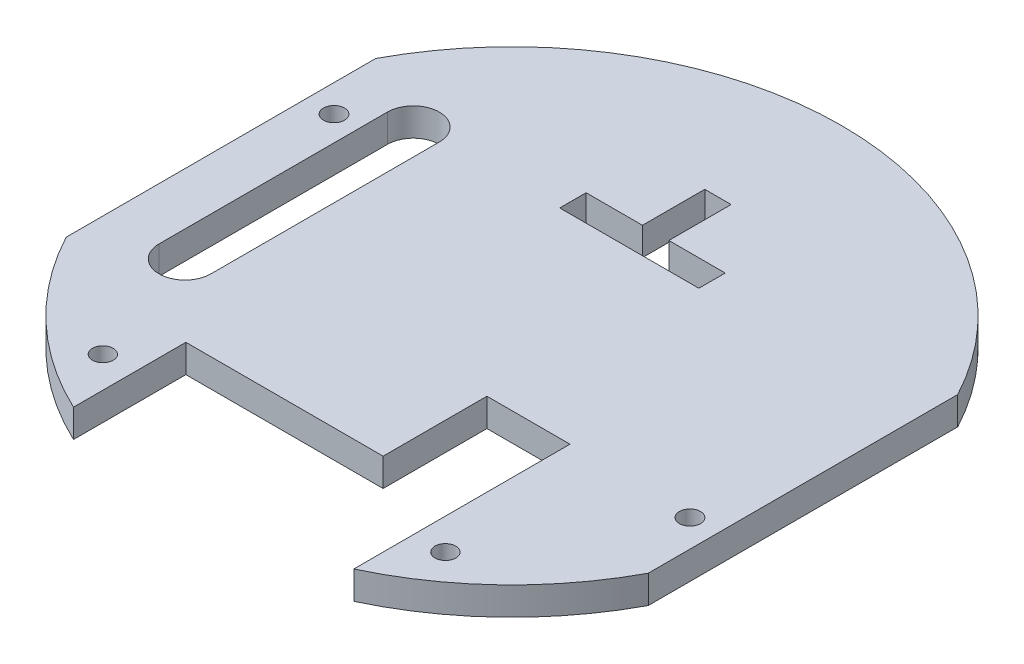
ISO-10303-21;
HEADER;
FILE_DESCRIPTION(('STEP AP214'),'2;1');
FILE_NAME('part.step','',(''),(''),'','','');
FILE_SCHEMA(('AUTOMOTIVE_DESIGN { 1 0 10303 214 1 1 1 1 }'));
ENDSEC;
DATA;
#1=APPLICATION_CONTEXT('core data for automotive mechanical design processes');
#2=APPLICATION_PROTOCOL_DEFINITION('international standard','automotive_design',2000,#1);
#3=PRODUCT_CONTEXT('',#1,'mechanical');
#4=PRODUCT('Part','Part','',(#3));
#5=PRODUCT_RELATED_PRODUCT_CATEGORY('part','',(#4));
#6=PRODUCT_DEFINITION_FORMATION('','',#4);
#7=PRODUCT_DEFINITION_CONTEXT('part definition',#1,'design');
#8=PRODUCT_DEFINITION('design','',#6,#7);
#9=PRODUCT_DEFINITION_SHAPE('','',#8);
#10=(LENGTH_UNIT() NAMED_UNIT(*) SI_UNIT(.MILLI.,.METRE.));
#11=(NAMED_UNIT(*) PLANE_ANGLE_UNIT() SI_UNIT($,.RADIAN.));
#12=(NAMED_UNIT(*) SI_UNIT($,.STERADIAN.) SOLID_ANGLE_UNIT());
#13=UNCERTAINTY_MEASURE_WITH_UNIT(LENGTH_MEASURE(1.E-05),#10,'distance_accuracy_value','');
#14=(GEOMETRIC_REPRESENTATION_CONTEXT(3) GLOBAL_UNCERTAINTY_ASSIGNED_CONTEXT((#13)) GLOBAL_UNIT_ASSIGNED_CONTEXT((#10,
#11,#12)) REPRESENTATION_CONTEXT('',''));
#15=CARTESIAN_POINT('',(0.,0.,0.));
#16=DIRECTION('',(0.,0.,1.));
#17=DIRECTION('',(1.,0.,0.));
#18=AXIS2_PLACEMENT_3D('',#15,#16,#17);
#19=CARTESIAN_POINT('',(0.,2.7,0.));
#20=DIRECTION('',(0.,-1.,0.));
#21=DIRECTION('',(0.,0.,-1.));
#22=AXIS2_PLACEMENT_3D('',#19,#20,#21);
#23=CYLINDRICAL_SURFACE('',#22,31.75);
#24=CARTESIAN_POINT('',(0.,0.,0.));
#25=DIRECTION('',(0.,1.,0.));
#26=DIRECTION('',(0.,0.,1.));
#27=AXIS2_PLACEMENT_3D('',#24,#25,#26);
#28=CIRCLE('',#27,31.75);
#29=CARTESIAN_POINT('',(-28.033586073271,0.,14.905722118452));
#30=VERTEX_POINT('',#29);
#31=CARTESIAN_POINT('',(-13.5,0.,28.7369535615729));
#32=VERTEX_POINT('',#31);
#33=EDGE_CURVE('E347',#30,#32,#28,.T.);
#34=ORIENTED_EDGE('',*,*,#33,.T.);
#35=DIRECTION('',(0.,-1.,0.));
#36=VECTOR('',#35,1.);
#37=CARTESIAN_POINT('',(-13.5,2.7,28.7369535615729));
#38=LINE('',#37,#36);
#39=CARTESIAN_POINT('',(-13.5,2.7,28.7369535615729));
#40=VERTEX_POINT('',#39);
#41=EDGE_CURVE('E363',#32,#40,#38,.F.);
#42=ORIENTED_EDGE('',*,*,#41,.T.);
#43=CARTESIAN_POINT('',(0.,2.7,0.));
#44=DIRECTION('',(0.,1.,0.));
#45=DIRECTION('',(0.,0.,1.));
#46=AXIS2_PLACEMENT_3D('',#43,#44,#45);
#47=CIRCLE('',#46,31.75);
#48=CARTESIAN_POINT('',(-28.033586073271,2.7,14.905722118452));
#49=VERTEX_POINT('',#48);
#50=EDGE_CURVE('E336',#49,#40,#47,.T.);
#51=ORIENTED_EDGE('',*,*,#50,.F.);
#52=DIRECTION('',(0.,-1.,0.));
#53=VECTOR('',#52,1.);
#54=CARTESIAN_POINT('',(-28.033586073271,2.7,14.905722118452));
#55=LINE('',#54,#53);
#56=EDGE_CURVE('E356',#49,#30,#55,.T.);
#57=ORIENTED_EDGE('',*,*,#56,.T.);
#58=EDGE_LOOP('',(#34,#42,#51,#57));
#59=FACE_BOUND('',#58,.T.);
#60=ADVANCED_FACE('F33',(#59),#23,.T.);
#61=CARTESIAN_POINT('',(6.69999999999999,2.7,-13.84));
#62=DIRECTION('',(0.,0.,1.));
#63=DIRECTION('',(1.,0.,0.));
#64=AXIS2_PLACEMENT_3D('',#61,#62,#63);
#65=PLANE('',#64);
#66=DIRECTION('',(0.,-1.,0.));
#67=VECTOR('',#66,1.);
#68=CARTESIAN_POINT('',(1.27,2.701,-13.84));
#69=LINE('',#68,#67);
#70=CARTESIAN_POINT('',(1.27,2.7,-13.84));
#71=VERTEX_POINT('',#70);
#72=CARTESIAN_POINT('',(1.27,0.,-13.84));
#73=VERTEX_POINT('',#72);
#74=EDGE_CURVE('E241',#71,#73,#69,.T.);
#75=ORIENTED_EDGE('',*,*,#74,.T.);
#76=DIRECTION('',(-1.,0.,0.));
#77=VECTOR('',#76,1.);
#78=CARTESIAN_POINT('',(6.69999999999999,0.,-13.84));
#79=LINE('',#78,#77);
#80=CARTESIAN_POINT('',(6.69999999999999,0.,-13.84));
#81=VERTEX_POINT('',#80);
#82=EDGE_CURVE('E310',#81,#73,#79,.T.);
#83=ORIENTED_EDGE('',*,*,#82,.F.);
#84=DIRECTION('',(0.,-1.,0.));
#85=VECTOR('',#84,1.);
#86=CARTESIAN_POINT('',(6.69999999999999,2.7,-13.84));
#87=LINE('',#86,#85);
#88=CARTESIAN_POINT('',(6.69999999999999,2.7,-13.84));
#89=VERTEX_POINT('',#88);
#90=EDGE_CURVE('E325',#89,#81,#87,.T.);
#91=ORIENTED_EDGE('',*,*,#90,.F.);
#92=DIRECTION('',(-1.,0.,0.));
#93=VECTOR('',#92,1.);
#94=CARTESIAN_POINT('',(6.69999999999999,2.7,-13.84));
#95=LINE('',#94,#93);
#96=EDGE_CURVE('E298',#89,#71,#95,.T.);
#97=ORIENTED_EDGE('',*,*,#96,.T.);
#98=EDGE_LOOP('',(#75,#83,#91,#97));
#99=FACE_BOUND('',#98,.T.);
#100=ADVANCED_FACE('F389',(#99),#65,.T.);
#101=CARTESIAN_POINT('',(0.,2.7,0.));
#102=DIRECTION('',(0.,1.,0.));
#103=DIRECTION('',(0.,0.,1.));
#104=AXIS2_PLACEMENT_3D('',#101,#102,#103);
#105=PLANE('',#104);
#106=CARTESIAN_POINT('',(16.5,2.7,22.9136652802601));
#107=DIRECTION('',(0.,1.,0.));
#108=DIRECTION('',(0.,0.,1.));
#109=AXIS2_PLACEMENT_3D('',#106,#107,#108);
#110=CIRCLE('',#109,1.00000000000001);
#111=CARTESIAN_POINT('',(16.5,2.7,23.9136652802601));
#112=VERTEX_POINT('',#111);
#113=EDGE_CURVE('E378',#112,#112,#110,.T.);
#114=ORIENTED_EDGE('',*,*,#113,.F.);
#115=EDGE_LOOP('',(#114));
#116=FACE_BOUND('',#115,.T.);
#117=CARTESIAN_POINT('',(-16.5,2.7,22.9136652802601));
#118=DIRECTION('',(0.,1.,0.));
#119=DIRECTION('',(0.,0.,1.));
#120=AXIS2_PLACEMENT_3D('',#117,#118,#119);
#121=CIRCLE('',#120,1.);
#122=CARTESIAN_POINT('',(-16.5,2.7,23.9136652802601));
#123=VERTEX_POINT('',#122);
#124=EDGE_CURVE('E370',#123,#123,#121,.T.);
#125=ORIENTED_EDGE('',*,*,#124,.F.);
#126=EDGE_LOOP('',(#125));
#127=FACE_BOUND('',#126,.T.);
#128=DIRECTION('',(0.,0.,1.));
#129=VECTOR('',#128,1.);
#130=CARTESIAN_POINT('',(-13.5,2.7,31.75));
#131=LINE('',#130,#129);
#132=CARTESIAN_POINT('',(-13.5,2.7,17.9136652802601));
#133=VERTEX_POINT('',#132);
#134=EDGE_CURVE('E203',#133,#40,#131,.T.);
#135=ORIENTED_EDGE('',*,*,#134,.F.);
#136=DIRECTION('',(-1.,0.,0.));
#137=VECTOR('',#136,1.);
#138=CARTESIAN_POINT('',(-13.5,2.7,17.9136652802601));
#139=LINE('',#138,#137);
#140=CARTESIAN_POINT('',(5.5,2.7,17.9136652802601));
#141=VERTEX_POINT('',#140);
#142=EDGE_CURVE('E195',#141,#133,#139,.T.);
#143=ORIENTED_EDGE('',*,*,#142,.F.);
#144=DIRECTION('',(0.,0.,1.));
#145=VECTOR('',#144,1.);
#146=CARTESIAN_POINT('',(5.5,2.7,17.9136652802601));
#147=LINE('',#146,#145);
#148=CARTESIAN_POINT('',(5.5,2.7,7.91366528026014));
#149=VERTEX_POINT('',#148);
#150=EDGE_CURVE('E210',#149,#141,#147,.T.);
#151=ORIENTED_EDGE('',*,*,#150,.F.);
#152=DIRECTION('',(-1.,0.,0.));
#153=VECTOR('',#152,1.);
#154=CARTESIAN_POINT('',(13.5,2.7,7.91366528026014));
#155=LINE('',#154,#153);
#156=CARTESIAN_POINT('',(13.5,2.7,7.91366528026014));
#157=VERTEX_POINT('',#156);
#158=EDGE_CURVE('E190',#157,#149,#155,.T.);
#159=ORIENTED_EDGE('',*,*,#158,.F.);
#160=DIRECTION('',(0.,0.,-1.));
#161=VECTOR('',#160,1.);
#162=CARTESIAN_POINT('',(13.5,2.7,17.9136652802601));
#163=LINE('',#162,#161);
#164=CARTESIAN_POINT('',(13.5,2.7,28.7369535615729));
#165=VERTEX_POINT('',#164);
#166=EDGE_CURVE('E198',#165,#157,#163,.T.);
#167=ORIENTED_EDGE('',*,*,#166,.F.);
#168=CARTESIAN_POINT('',(28.033586073271,2.7,14.905722118452));
#169=VERTEX_POINT('',#168);
#170=EDGE_CURVE('E335',#165,#169,#47,.T.);
#171=ORIENTED_EDGE('',*,*,#170,.T.);
#172=DIRECTION('',(0.,0.,-1.));
#173=VECTOR('',#172,1.);
#174=CARTESIAN_POINT('',(28.033586073271,2.7,-14.905722118452));
#175=LINE('',#174,#173);
#176=CARTESIAN_POINT('',(28.033586073271,2.7,-14.905722118452));
#177=VERTEX_POINT('',#176);
#178=EDGE_CURVE('E339',#169,#177,#175,.T.);
#179=ORIENTED_EDGE('',*,*,#178,.T.);
#180=CARTESIAN_POINT('',(0.,2.7,0.));
#181=DIRECTION('',(0.,1.,0.));
#182=DIRECTION('',(0.,0.,1.));
#183=AXIS2_PLACEMENT_3D('',#180,#181,#182);
#184=CIRCLE('',#183,31.75);
#185=CARTESIAN_POINT('',(-28.033586073271,2.7,-14.905722118452));
#186=VERTEX_POINT('',#185);
#187=EDGE_CURVE('E329',#177,#186,#184,.T.);
#188=ORIENTED_EDGE('',*,*,#187,.T.);
#189=DIRECTION('',(0.,0.,1.));
#190=VECTOR('',#189,1.);
#191=CARTESIAN_POINT('',(-28.033586073271,2.7,-14.905722118452));
#192=LINE('',#191,#190);
#193=EDGE_CURVE('E332',#186,#49,#192,.T.);
#194=ORIENTED_EDGE('',*,*,#193,.T.);
#195=ORIENTED_EDGE('',*,*,#50,.T.);
#196=EDGE_LOOP('',(#135,#143,#151,#159,#167,#171,#179,#188,#194,#195));
#197=FACE_BOUND('',#196,.T.);
#198=DIRECTION('',(0.,0.,1.));
#199=VECTOR('',#198,1.);
#200=CARTESIAN_POINT('',(1.27,2.7,-13.84));
#201=LINE('',#200,#199);
#202=CARTESIAN_POINT('',(1.26999999999998,2.7,-19.84));
#203=VERTEX_POINT('',#202);
#204=EDGE_CURVE('E230',#203,#71,#201,.T.);
#205=ORIENTED_EDGE('',*,*,#204,.T.);
#206=ORIENTED_EDGE('',*,*,#96,.F.);
#207=DIRECTION('',(0.,0.,-1.));
#208=VECTOR('',#207,1.);
#209=CARTESIAN_POINT('',(6.69999999999999,2.7,-13.84));
#210=LINE('',#209,#208);
#211=CARTESIAN_POINT('',(6.69999999999999,2.7,-11.3));
#212=VERTEX_POINT('',#211);
#213=EDGE_CURVE('E294',#212,#89,#210,.T.);
#214=ORIENTED_EDGE('',*,*,#213,.F.);
#215=DIRECTION('',(1.,0.,0.));
#216=VECTOR('',#215,1.);
#217=CARTESIAN_POINT('',(6.69999999999999,2.7,-11.3));
#218=LINE('',#217,#216);
#219=CARTESIAN_POINT('',(-6.69999999999999,2.7,-11.3));
#220=VERTEX_POINT('',#219);
#221=EDGE_CURVE('E304',#220,#212,#218,.T.);
#222=ORIENTED_EDGE('',*,*,#221,.F.);
#223=DIRECTION('',(0.,0.,1.));
#224=VECTOR('',#223,1.);
#225=CARTESIAN_POINT('',(-6.69999999999999,2.7,-13.84));
#226=LINE('',#225,#224);
#227=CARTESIAN_POINT('',(-6.69999999999999,2.7,-13.84));
#228=VERTEX_POINT('',#227);
#229=EDGE_CURVE('E301',#228,#220,#226,.T.);
#230=ORIENTED_EDGE('',*,*,#229,.F.);
#231=CARTESIAN_POINT('',(-1.27000000000002,2.7,-13.84));
#232=VERTEX_POINT('',#231);
#233=EDGE_CURVE('E296',#232,#228,#95,.T.);
#234=ORIENTED_EDGE('',*,*,#233,.F.);
#235=DIRECTION('',(0.,0.,-1.));
#236=VECTOR('',#235,1.);
#237=CARTESIAN_POINT('',(-1.27000000000002,2.7,-13.84));
#238=LINE('',#237,#236);
#239=CARTESIAN_POINT('',(-1.27000000000002,2.7,-19.84));
#240=VERTEX_POINT('',#239);
#241=EDGE_CURVE('E58',#232,#240,#238,.T.);
#242=ORIENTED_EDGE('',*,*,#241,.T.);
#243=DIRECTION('',(1.,0.,0.));
#244=VECTOR('',#243,1.);
#245=CARTESIAN_POINT('',(1.26999999999998,2.7,-19.84));
#246=LINE('',#245,#244);
#247=EDGE_CURVE('E227',#240,#203,#246,.T.);
#248=ORIENTED_EDGE('',*,*,#247,.T.);
#249=EDGE_LOOP('',(#205,#206,#214,#222,#230,#234,#242,#248));
#250=FACE_BOUND('',#249,.T.);
#251=CARTESIAN_POINT('',(25.4,2.7,8.255));
#252=DIRECTION('',(0.,1.,0.));
#253=DIRECTION('',(0.,0.,1.));
#254=AXIS2_PLACEMENT_3D('',#251,#252,#253);
#255=CIRCLE('',#254,1.016);
#256=CARTESIAN_POINT('',(25.4,2.7,9.271));
#257=VERTEX_POINT('',#256);
#258=EDGE_CURVE('E244',#257,#257,#255,.T.);
#259=ORIENTED_EDGE('',*,*,#258,.F.);
#260=EDGE_LOOP('',(#259));
#261=FACE_BOUND('',#260,.T.);
#262=CARTESIAN_POINT('',(-25.4,2.7,-8.255));
#263=DIRECTION('',(0.,1.,0.));
#264=DIRECTION('',(0.,0.,1.));
#265=AXIS2_PLACEMENT_3D('',#262,#263,#264);
#266=CIRCLE('',#265,1.016);
#267=CARTESIAN_POINT('',(-25.4,2.7,-7.239));
#268=VERTEX_POINT('',#267);
#269=EDGE_CURVE('E254',#268,#268,#266,.T.);
#270=ORIENTED_EDGE('',*,*,#269,.F.);
#271=EDGE_LOOP('',(#270));
#272=FACE_BOUND('',#271,.T.);
#273=CARTESIAN_POINT('',(-20.5,2.7,-11.));
#274=DIRECTION('',(0.,1.,0.));
#275=DIRECTION('',(0.,0.,1.));
#276=AXIS2_PLACEMENT_3D('',#273,#274,#275);
#277=CIRCLE('',#276,2.5);
#278=CARTESIAN_POINT('',(-18.,2.7,-11.));
#279=VERTEX_POINT('',#278);
#280=CARTESIAN_POINT('',(-23.,2.7,-11.));
#281=VERTEX_POINT('',#280);
#282=EDGE_CURVE('E270',#279,#281,#277,.T.);
#283=ORIENTED_EDGE('',*,*,#282,.F.);
#284=DIRECTION('',(0.,0.,-1.));
#285=VECTOR('',#284,1.);
#286=CARTESIAN_POINT('',(-18.,2.7,-11.));
#287=LINE('',#286,#285);
#288=CARTESIAN_POINT('',(-18.,2.7,11.));
#289=VERTEX_POINT('',#288);
#290=EDGE_CURVE('E278',#289,#279,#287,.T.);
#291=ORIENTED_EDGE('',*,*,#290,.F.);
#292=CARTESIAN_POINT('',(-20.5,2.7,11.));
#293=DIRECTION('',(0.,1.,0.));
#294=DIRECTION('',(0.,0.,1.));
#295=AXIS2_PLACEMENT_3D('',#292,#293,#294);
#296=CIRCLE('',#295,2.5);
#297=CARTESIAN_POINT('',(-23.,2.7,11.));
#298=VERTEX_POINT('',#297);
#299=EDGE_CURVE('E275',#298,#289,#296,.T.);
#300=ORIENTED_EDGE('',*,*,#299,.F.);
#301=DIRECTION('',(0.,0.,1.));
#302=VECTOR('',#301,1.);
#303=CARTESIAN_POINT('',(-23.,2.7,-11.));
#304=LINE('',#303,#302);
#305=EDGE_CURVE('E272',#281,#298,#304,.T.);
#306=ORIENTED_EDGE('',*,*,#305,.F.);
#307=EDGE_LOOP('',(#283,#291,#300,#306));
#308=FACE_BOUND('',#307,.T.);
#309=ADVANCED_FACE('F206',(#116,#127,#197,#250,#261,#272,#308),#105,.T.);
#310=CARTESIAN_POINT('',(0.,0.,0.));
#311=DIRECTION('',(0.,1.,0.));
#312=DIRECTION('',(0.,0.,1.));
#313=AXIS2_PLACEMENT_3D('',#310,#311,#312);
#314=PLANE('',#313);
#315=CARTESIAN_POINT('',(16.5,0.,22.9136652802601));
#316=DIRECTION('',(0.,1.,0.));
#317=DIRECTION('',(0.,0.,1.));
#318=AXIS2_PLACEMENT_3D('',#315,#316,#317);
#319=CIRCLE('',#318,1.00000000000001);
#320=CARTESIAN_POINT('',(16.5,0.,23.9136652802601));
#321=VERTEX_POINT('',#320);
#322=EDGE_CURVE('E37',#321,#321,#319,.T.);
#323=ORIENTED_EDGE('',*,*,#322,.T.);
#324=EDGE_LOOP('',(#323));
#325=FACE_BOUND('',#324,.T.);
#326=CARTESIAN_POINT('',(-16.5,0.,22.9136652802601));
#327=DIRECTION('',(0.,1.,0.));
#328=DIRECTION('',(0.,0.,1.));
#329=AXIS2_PLACEMENT_3D('',#326,#327,#328);
#330=CIRCLE('',#329,1.);
#331=CARTESIAN_POINT('',(-16.5,0.,23.9136652802601));
#332=VERTEX_POINT('',#331);
#333=EDGE_CURVE('E368',#332,#332,#330,.T.);
#334=ORIENTED_EDGE('',*,*,#333,.T.);
#335=EDGE_LOOP('',(#334));
#336=FACE_BOUND('',#335,.T.);
#337=CARTESIAN_POINT('',(25.4,0.,8.255));
#338=DIRECTION('',(0.,1.,0.));
#339=DIRECTION('',(0.,0.,1.));
#340=AXIS2_PLACEMENT_3D('',#337,#338,#339);
#341=CIRCLE('',#340,1.016);
#342=CARTESIAN_POINT('',(25.4,0.,9.271));
#343=VERTEX_POINT('',#342);
#344=EDGE_CURVE('E251',#343,#343,#341,.T.);
#345=ORIENTED_EDGE('',*,*,#344,.T.);
#346=EDGE_LOOP('',(#345));
#347=FACE_BOUND('',#346,.T.);
#348=CARTESIAN_POINT('',(-25.4,0.,-8.255));
#349=DIRECTION('',(0.,1.,0.));
#350=DIRECTION('',(0.,0.,1.));
#351=AXIS2_PLACEMENT_3D('',#348,#349,#350);
#352=CIRCLE('',#351,1.016);
#353=CARTESIAN_POINT('',(-25.4,0.,-7.239));
#354=VERTEX_POINT('',#353);
#355=EDGE_CURVE('E257',#354,#354,#352,.T.);
#356=ORIENTED_EDGE('',*,*,#355,.T.);
#357=EDGE_LOOP('',(#356));
#358=FACE_BOUND('',#357,.T.);
#359=DIRECTION('',(0.,0.,1.));
#360=VECTOR('',#359,1.);
#361=CARTESIAN_POINT('',(-18.,0.,-11.));
#362=LINE('',#361,#360);
#363=CARTESIAN_POINT('',(-18.,0.,-11.));
#364=VERTEX_POINT('',#363);
#365=CARTESIAN_POINT('',(-18.,0.,11.));
#366=VERTEX_POINT('',#365);
#367=EDGE_CURVE('E264',#364,#366,#362,.T.);
#368=ORIENTED_EDGE('',*,*,#367,.F.);
#369=CARTESIAN_POINT('',(-20.5,0.,-11.));
#370=DIRECTION('',(0.,1.,0.));
#371=DIRECTION('',(0.,0.,1.));
#372=AXIS2_PLACEMENT_3D('',#369,#370,#371);
#373=CIRCLE('',#372,2.5);
#374=CARTESIAN_POINT('',(-23.,0.,-11.));
#375=VERTEX_POINT('',#374);
#376=EDGE_CURVE('E267',#375,#364,#373,.F.);
#377=ORIENTED_EDGE('',*,*,#376,.F.);
#378=DIRECTION('',(0.,0.,-1.));
#379=VECTOR('',#378,1.);
#380=CARTESIAN_POINT('',(-23.,0.,-11.));
#381=LINE('',#380,#379);
#382=CARTESIAN_POINT('',(-23.,0.,11.));
#383=VERTEX_POINT('',#382);
#384=EDGE_CURVE('E284',#383,#375,#381,.T.);
#385=ORIENTED_EDGE('',*,*,#384,.F.);
#386=CARTESIAN_POINT('',(-20.5,0.,11.));
#387=DIRECTION('',(0.,1.,0.));
#388=DIRECTION('',(0.,0.,1.));
#389=AXIS2_PLACEMENT_3D('',#386,#387,#388);
#390=CIRCLE('',#389,2.5);
#391=EDGE_CURVE('E260',#366,#383,#390,.F.);
#392=ORIENTED_EDGE('',*,*,#391,.F.);
#393=EDGE_LOOP('',(#368,#377,#385,#392));
#394=FACE_BOUND('',#393,.T.);
#395=DIRECTION('',(-1.,0.,0.));
#396=VECTOR('',#395,1.);
#397=CARTESIAN_POINT('',(0.,0.,17.9136652802601));
#398=LINE('',#397,#396);
#399=CARTESIAN_POINT('',(5.5,0.,17.9136652802601));
#400=VERTEX_POINT('',#399);
#401=CARTESIAN_POINT('',(-13.5,0.,17.9136652802601));
#402=VERTEX_POINT('',#401);
#403=EDGE_CURVE('E11',#400,#402,#398,.T.);
#404=ORIENTED_EDGE('',*,*,#403,.T.);
#405=DIRECTION('',(0.,0.,1.));
#406=VECTOR('',#405,1.);
#407=CARTESIAN_POINT('',(-13.5,0.,0.));
#408=LINE('',#407,#406);
#409=EDGE_CURVE('E223',#402,#32,#408,.T.);
#410=ORIENTED_EDGE('',*,*,#409,.T.);
#411=ORIENTED_EDGE('',*,*,#33,.F.);
#412=DIRECTION('',(0.,0.,1.));
#413=VECTOR('',#412,1.);
#414=CARTESIAN_POINT('',(-28.033586073271,0.,-14.905722118452));
#415=LINE('',#414,#413);
#416=CARTESIAN_POINT('',(-28.033586073271,0.,-14.905722118452));
#417=VERTEX_POINT('',#416);
#418=EDGE_CURVE('E344',#417,#30,#415,.T.);
#419=ORIENTED_EDGE('',*,*,#418,.F.);
#420=CARTESIAN_POINT('',(0.,0.,0.));
#421=DIRECTION('',(0.,1.,0.));
#422=DIRECTION('',(0.,0.,1.));
#423=AXIS2_PLACEMENT_3D('',#420,#421,#422);
#424=CIRCLE('',#423,31.75);
#425=CARTESIAN_POINT('',(28.033586073271,0.,-14.905722118452));
#426=VERTEX_POINT('',#425);
#427=EDGE_CURVE('E328',#426,#417,#424,.T.);
#428=ORIENTED_EDGE('',*,*,#427,.F.);
#429=DIRECTION('',(0.,0.,-1.));
#430=VECTOR('',#429,1.);
#431=CARTESIAN_POINT('',(28.033586073271,0.,-14.905722118452));
#432=LINE('',#431,#430);
#433=CARTESIAN_POINT('',(28.033586073271,0.,14.905722118452));
#434=VERTEX_POINT('',#433);
#435=EDGE_CURVE('E333',#434,#426,#432,.T.);
#436=ORIENTED_EDGE('',*,*,#435,.F.);
#437=CARTESIAN_POINT('',(13.5,0.,28.7369535615729));
#438=VERTEX_POINT('',#437);
#439=EDGE_CURVE('E346',#438,#434,#28,.T.);
#440=ORIENTED_EDGE('',*,*,#439,.F.);
#441=DIRECTION('',(0.,0.,-1.));
#442=VECTOR('',#441,1.);
#443=CARTESIAN_POINT('',(13.5,0.,0.));
#444=LINE('',#443,#442);
#445=CARTESIAN_POINT('',(13.5,0.,7.91366528026014));
#446=VERTEX_POINT('',#445);
#447=EDGE_CURVE('E50',#438,#446,#444,.T.);
#448=ORIENTED_EDGE('',*,*,#447,.T.);
#449=DIRECTION('',(-1.,0.,0.));
#450=VECTOR('',#449,1.);
#451=CARTESIAN_POINT('',(0.,0.,7.91366528026014));
#452=LINE('',#451,#450);
#453=CARTESIAN_POINT('',(5.5,0.,7.91366528026014));
#454=VERTEX_POINT('',#453);
#455=EDGE_CURVE('E193',#446,#454,#452,.T.);
#456=ORIENTED_EDGE('',*,*,#455,.T.);
#457=DIRECTION('',(0.,0.,1.));
#458=VECTOR('',#457,1.);
#459=CARTESIAN_POINT('',(5.5,0.,0.));
#460=LINE('',#459,#458);
#461=EDGE_CURVE('E42',#454,#400,#460,.T.);
#462=ORIENTED_EDGE('',*,*,#461,.T.);
#463=EDGE_LOOP('',(#404,#410,#411,#419,#428,#436,#440,#448,#456,#462));
#464=FACE_BOUND('',#463,.T.);
#465=ORIENTED_EDGE('',*,*,#82,.T.);
#466=DIRECTION('',(0.,0.,1.));
#467=VECTOR('',#466,1.);
#468=CARTESIAN_POINT('',(1.27,0.,-13.84));
#469=LINE('',#468,#467);
#470=CARTESIAN_POINT('',(1.26999999999998,0.,-19.84));
#471=VERTEX_POINT('',#470);
#472=EDGE_CURVE('E233',#471,#73,#469,.T.);
#473=ORIENTED_EDGE('',*,*,#472,.F.);
#474=DIRECTION('',(1.,0.,0.));
#475=VECTOR('',#474,1.);
#476=CARTESIAN_POINT('',(1.26999999999998,0.,-19.84));
#477=LINE('',#476,#475);
#478=CARTESIAN_POINT('',(-1.27000000000002,0.,-19.84));
#479=VERTEX_POINT('',#478);
#480=EDGE_CURVE('E238',#479,#471,#477,.T.);
#481=ORIENTED_EDGE('',*,*,#480,.F.);
#482=DIRECTION('',(0.,0.,-1.));
#483=VECTOR('',#482,1.);
#484=CARTESIAN_POINT('',(-1.27000000000002,0.,-13.84));
#485=LINE('',#484,#483);
#486=CARTESIAN_POINT('',(-1.27000000000002,0.,-13.84));
#487=VERTEX_POINT('',#486);
#488=EDGE_CURVE('E235',#487,#479,#485,.T.);
#489=ORIENTED_EDGE('',*,*,#488,.F.);
#490=CARTESIAN_POINT('',(-6.69999999999999,0.,-13.84));
#491=VERTEX_POINT('',#490);
#492=EDGE_CURVE('E309',#487,#491,#79,.T.);
#493=ORIENTED_EDGE('',*,*,#492,.T.);
#494=DIRECTION('',(0.,0.,1.));
#495=VECTOR('',#494,1.);
#496=CARTESIAN_POINT('',(-6.69999999999999,0.,-13.84));
#497=LINE('',#496,#495);
#498=CARTESIAN_POINT('',(-6.69999999999999,0.,-11.3));
#499=VERTEX_POINT('',#498);
#500=EDGE_CURVE('E313',#491,#499,#497,.T.);
#501=ORIENTED_EDGE('',*,*,#500,.T.);
#502=DIRECTION('',(1.,0.,0.));
#503=VECTOR('',#502,1.);
#504=CARTESIAN_POINT('',(6.69999999999999,0.,-11.3));
#505=LINE('',#504,#503);
#506=CARTESIAN_POINT('',(6.69999999999999,0.,-11.3));
#507=VERTEX_POINT('',#506);
#508=EDGE_CURVE('E297',#499,#507,#505,.T.);
#509=ORIENTED_EDGE('',*,*,#508,.T.);
#510=DIRECTION('',(0.,0.,-1.));
#511=VECTOR('',#510,1.);
#512=CARTESIAN_POINT('',(6.69999999999999,0.,-13.84));
#513=LINE('',#512,#511);
#514=EDGE_CURVE('E293',#507,#81,#513,.T.);
#515=ORIENTED_EDGE('',*,*,#514,.T.);
#516=EDGE_LOOP('',(#465,#473,#481,#489,#493,#501,#509,#515));
#517=FACE_BOUND('',#516,.T.);
#518=ADVANCED_FACE('F388',(#325,#336,#347,#358,#394,#464,#517),#314,.F.);
#519=CARTESIAN_POINT('',(0.,2.7,0.));
#520=DIRECTION('',(0.,-1.,0.));
#521=DIRECTION('',(0.,0.,-1.));
#522=AXIS2_PLACEMENT_3D('',#519,#520,#521);
#523=CYLINDRICAL_SURFACE('',#522,31.75);
#524=ORIENTED_EDGE('',*,*,#427,.T.);
#525=DIRECTION('',(0.,-1.,0.));
#526=VECTOR('',#525,1.);
#527=CARTESIAN_POINT('',(-28.033586073271,2.7,-14.905722118452));
#528=LINE('',#527,#526);
#529=EDGE_CURVE('E359',#186,#417,#528,.T.);
#530=ORIENTED_EDGE('',*,*,#529,.F.);
#531=ORIENTED_EDGE('',*,*,#187,.F.);
#532=DIRECTION('',(0.,-1.,0.));
#533=VECTOR('',#532,1.);
#534=CARTESIAN_POINT('',(28.033586073271,2.7,-14.905722118452));
#535=LINE('',#534,#533);
#536=EDGE_CURVE('E341',#177,#426,#535,.T.);
#537=ORIENTED_EDGE('',*,*,#536,.T.);
#538=EDGE_LOOP('',(#524,#530,#531,#537));
#539=FACE_BOUND('',#538,.T.);
#540=ADVANCED_FACE('F35',(#539),#523,.T.);
#541=CARTESIAN_POINT('',(-28.033586073271,2.7,-14.905722118452));
#542=DIRECTION('',(1.,0.,0.));
#543=DIRECTION('',(0.,0.,-1.));
#544=AXIS2_PLACEMENT_3D('',#541,#542,#543);
#545=PLANE('',#544);
#546=ORIENTED_EDGE('',*,*,#418,.T.);
#547=ORIENTED_EDGE('',*,*,#56,.F.);
#548=ORIENTED_EDGE('',*,*,#193,.F.);
#549=ORIENTED_EDGE('',*,*,#529,.T.);
#550=EDGE_LOOP('',(#546,#547,#548,#549));
#551=FACE_BOUND('',#550,.T.);
#552=ADVANCED_FACE('F410',(#551),#545,.F.);
#553=ORIENTED_EDGE('',*,*,#170,.F.);
#554=DIRECTION('',(0.,-1.,0.));
#555=VECTOR('',#554,1.);
#556=CARTESIAN_POINT('',(13.5,2.7,28.7369535615729));
#557=LINE('',#556,#555);
#558=EDGE_CURVE('E200',#165,#438,#557,.T.);
#559=ORIENTED_EDGE('',*,*,#558,.T.);
#560=ORIENTED_EDGE('',*,*,#439,.T.);
#561=DIRECTION('',(0.,-1.,0.));
#562=VECTOR('',#561,1.);
#563=CARTESIAN_POINT('',(28.033586073271,2.7,14.905722118452));
#564=LINE('',#563,#562);
#565=EDGE_CURVE('E353',#169,#434,#564,.T.);
#566=ORIENTED_EDGE('',*,*,#565,.F.);
#567=EDGE_LOOP('',(#553,#559,#560,#566));
#568=FACE_BOUND('',#567,.T.);
#569=ADVANCED_FACE('F404',(#568),#23,.T.);
#570=CARTESIAN_POINT('',(28.033586073271,2.7,-14.905722118452));
#571=DIRECTION('',(-1.,0.,0.));
#572=DIRECTION('',(0.,0.,1.));
#573=AXIS2_PLACEMENT_3D('',#570,#571,#572);
#574=PLANE('',#573);
#575=ORIENTED_EDGE('',*,*,#435,.T.);
#576=ORIENTED_EDGE('',*,*,#536,.F.);
#577=ORIENTED_EDGE('',*,*,#178,.F.);
#578=ORIENTED_EDGE('',*,*,#565,.T.);
#579=EDGE_LOOP('',(#575,#576,#577,#578));
#580=FACE_BOUND('',#579,.T.);
#581=ADVANCED_FACE('F409',(#580),#574,.F.);
#582=CARTESIAN_POINT('',(6.69999999999999,2.7,-13.84));
#583=DIRECTION('',(-1.,0.,0.));
#584=DIRECTION('',(0.,0.,1.));
#585=AXIS2_PLACEMENT_3D('',#582,#583,#584);
#586=PLANE('',#585);
#587=ORIENTED_EDGE('',*,*,#514,.F.);
#588=DIRECTION('',(0.,-1.,0.));
#589=VECTOR('',#588,1.);
#590=CARTESIAN_POINT('',(6.69999999999999,2.7,-11.3));
#591=LINE('',#590,#589);
#592=EDGE_CURVE('E306',#212,#507,#591,.T.);
#593=ORIENTED_EDGE('',*,*,#592,.F.);
#594=ORIENTED_EDGE('',*,*,#213,.T.);
#595=ORIENTED_EDGE('',*,*,#90,.T.);
#596=EDGE_LOOP('',(#587,#593,#594,#595));
#597=FACE_BOUND('',#596,.T.);
#598=ADVANCED_FACE('F416',(#597),#586,.T.);
#599=DIRECTION('',(0.,-1.,0.));
#600=VECTOR('',#599,1.);
#601=CARTESIAN_POINT('',(-1.27000000000002,2.701,-13.84));
#602=LINE('',#601,#600);
#603=EDGE_CURVE('E247',#232,#487,#602,.T.);
#604=ORIENTED_EDGE('',*,*,#603,.F.);
#605=ORIENTED_EDGE('',*,*,#233,.T.);
#606=DIRECTION('',(0.,-1.,0.));
#607=VECTOR('',#606,1.);
#608=CARTESIAN_POINT('',(-6.69999999999999,2.7,-13.84));
#609=LINE('',#608,#607);
#610=EDGE_CURVE('E322',#228,#491,#609,.T.);
#611=ORIENTED_EDGE('',*,*,#610,.T.);
#612=ORIENTED_EDGE('',*,*,#492,.F.);
#613=EDGE_LOOP('',(#604,#605,#611,#612));
#614=FACE_BOUND('',#613,.T.);
#615=ADVANCED_FACE('F399',(#614),#65,.T.);
#616=CARTESIAN_POINT('',(-6.69999999999999,2.7,-13.84));
#617=DIRECTION('',(1.,0.,0.));
#618=DIRECTION('',(0.,0.,-1.));
#619=AXIS2_PLACEMENT_3D('',#616,#617,#618);
#620=PLANE('',#619);
#621=ORIENTED_EDGE('',*,*,#500,.F.);
#622=ORIENTED_EDGE('',*,*,#610,.F.);
#623=ORIENTED_EDGE('',*,*,#229,.T.);
#624=DIRECTION('',(0.,-1.,0.));
#625=VECTOR('',#624,1.);
#626=CARTESIAN_POINT('',(-6.69999999999999,2.7,-11.3));
#627=LINE('',#626,#625);
#628=EDGE_CURVE('E320',#220,#499,#627,.T.);
#629=ORIENTED_EDGE('',*,*,#628,.T.);
#630=EDGE_LOOP('',(#621,#622,#623,#629));
#631=FACE_BOUND('',#630,.T.);
#632=ADVANCED_FACE('F494',(#631),#620,.T.);
#633=CARTESIAN_POINT('',(6.69999999999999,2.7,-11.3));
#634=DIRECTION('',(0.,0.,-1.));
#635=DIRECTION('',(-1.,0.,0.));
#636=AXIS2_PLACEMENT_3D('',#633,#634,#635);
#637=PLANE('',#636);
#638=ORIENTED_EDGE('',*,*,#508,.F.);
#639=ORIENTED_EDGE('',*,*,#628,.F.);
#640=ORIENTED_EDGE('',*,*,#221,.T.);
#641=ORIENTED_EDGE('',*,*,#592,.T.);
#642=EDGE_LOOP('',(#638,#639,#640,#641));
#643=FACE_BOUND('',#642,.T.);
#644=ADVANCED_FACE('F490',(#643),#637,.T.);
#645=CARTESIAN_POINT('',(-20.5,-0.00100000000000013,-11.));
#646=DIRECTION('',(0.,1.,0.));
#647=DIRECTION('',(0.,0.,1.));
#648=AXIS2_PLACEMENT_3D('',#645,#646,#647);
#649=CYLINDRICAL_SURFACE('',#648,2.5);
#650=ORIENTED_EDGE('',*,*,#376,.T.);
#651=DIRECTION('',(0.,1.,0.));
#652=VECTOR('',#651,1.);
#653=CARTESIAN_POINT('',(-18.,-0.00100000000000013,-11.));
#654=LINE('',#653,#652);
#655=EDGE_CURVE('E282',#364,#279,#654,.T.);
#656=ORIENTED_EDGE('',*,*,#655,.T.);
#657=ORIENTED_EDGE('',*,*,#282,.T.);
#658=DIRECTION('',(0.,1.,0.));
#659=VECTOR('',#658,1.);
#660=CARTESIAN_POINT('',(-23.,-0.00100000000000013,-11.));
#661=LINE('',#660,#659);
#662=EDGE_CURVE('E281',#375,#281,#661,.T.);
#663=ORIENTED_EDGE('',*,*,#662,.F.);
#664=EDGE_LOOP('',(#650,#656,#657,#663));
#665=FACE_BOUND('',#664,.T.);
#666=ADVANCED_FACE('F480',(#665),#649,.F.);
#667=CARTESIAN_POINT('',(-18.,-0.00100000000000013,-11.));
#668=DIRECTION('',(1.,0.,0.));
#669=DIRECTION('',(0.,0.,-1.));
#670=AXIS2_PLACEMENT_3D('',#667,#668,#669);
#671=PLANE('',#670);
#672=ORIENTED_EDGE('',*,*,#367,.T.);
#673=DIRECTION('',(0.,1.,0.));
#674=VECTOR('',#673,1.);
#675=CARTESIAN_POINT('',(-18.,-0.00100000000000013,11.));
#676=LINE('',#675,#674);
#677=EDGE_CURVE('E285',#366,#289,#676,.T.);
#678=ORIENTED_EDGE('',*,*,#677,.T.);
#679=ORIENTED_EDGE('',*,*,#290,.T.);
#680=ORIENTED_EDGE('',*,*,#655,.F.);
#681=EDGE_LOOP('',(#672,#678,#679,#680));
#682=FACE_BOUND('',#681,.T.);
#683=ADVANCED_FACE('F476',(#682),#671,.F.);
#684=CARTESIAN_POINT('',(-20.5,-0.00100000000000013,11.));
#685=DIRECTION('',(0.,1.,0.));
#686=DIRECTION('',(0.,0.,1.));
#687=AXIS2_PLACEMENT_3D('',#684,#685,#686);
#688=CYLINDRICAL_SURFACE('',#687,2.5);
#689=ORIENTED_EDGE('',*,*,#391,.T.);
#690=DIRECTION('',(0.,1.,0.));
#691=VECTOR('',#690,1.);
#692=CARTESIAN_POINT('',(-23.,-0.00100000000000013,11.));
#693=LINE('',#692,#691);
#694=EDGE_CURVE('E287',#383,#298,#693,.T.);
#695=ORIENTED_EDGE('',*,*,#694,.T.);
#696=ORIENTED_EDGE('',*,*,#299,.T.);
#697=ORIENTED_EDGE('',*,*,#677,.F.);
#698=EDGE_LOOP('',(#689,#695,#696,#697));
#699=FACE_BOUND('',#698,.T.);
#700=ADVANCED_FACE('F479',(#699),#688,.F.);
#701=CARTESIAN_POINT('',(-23.,-0.00100000000000013,-11.));
#702=DIRECTION('',(-1.,0.,0.));
#703=DIRECTION('',(0.,0.,1.));
#704=AXIS2_PLACEMENT_3D('',#701,#702,#703);
#705=PLANE('',#704);
#706=ORIENTED_EDGE('',*,*,#384,.T.);
#707=ORIENTED_EDGE('',*,*,#662,.T.);
#708=ORIENTED_EDGE('',*,*,#305,.T.);
#709=ORIENTED_EDGE('',*,*,#694,.F.);
#710=EDGE_LOOP('',(#706,#707,#708,#709));
#711=FACE_BOUND('',#710,.T.);
#712=ADVANCED_FACE('F474',(#711),#705,.F.);
#713=CARTESIAN_POINT('',(-25.4,0.,-8.255));
#714=DIRECTION('',(0.,1.,0.));
#715=DIRECTION('',(0.,0.,1.));
#716=AXIS2_PLACEMENT_3D('',#713,#714,#715);
#717=CYLINDRICAL_SURFACE('',#716,1.016);
#718=CARTESIAN_POINT('',(-25.4,0.,-7.239));
#719=CARTESIAN_POINT('',(-25.4,0.028125,-7.239));
#720=CARTESIAN_POINT('',(-25.4,0.05625,-7.239));
#721=CARTESIAN_POINT('',(-25.4,0.1125,-7.239));
#722=CARTESIAN_POINT('',(-25.4,0.140625,-7.239));
#723=CARTESIAN_POINT('',(-25.4,0.196875,-7.239));
#724=CARTESIAN_POINT('',(-25.4,0.225,-7.239));
#725=CARTESIAN_POINT('',(-25.4,0.28125,-7.239));
#726=CARTESIAN_POINT('',(-25.4,0.309375,-7.239));
#727=CARTESIAN_POINT('',(-25.4,0.365625,-7.239));
#728=CARTESIAN_POINT('',(-25.4,0.39375,-7.239));
#729=CARTESIAN_POINT('',(-25.4,0.45,-7.239));
#730=CARTESIAN_POINT('',(-25.4,0.478125,-7.239));
#731=CARTESIAN_POINT('',(-25.4,0.534375,-7.239));
#732=CARTESIAN_POINT('',(-25.4,0.5625,-7.239));
#733=CARTESIAN_POINT('',(-25.4,0.61875,-7.239));
#734=CARTESIAN_POINT('',(-25.4,0.646875,-7.239));
#735=CARTESIAN_POINT('',(-25.4,0.703125,-7.239));
#736=CARTESIAN_POINT('',(-25.4,0.73125,-7.239));
#737=CARTESIAN_POINT('',(-25.4,0.7875,-7.239));
#738=CARTESIAN_POINT('',(-25.4,0.815625,-7.239));
#739=CARTESIAN_POINT('',(-25.4,0.871875,-7.239));
#740=CARTESIAN_POINT('',(-25.4,0.9,-7.239));
#741=CARTESIAN_POINT('',(-25.4,0.95625,-7.239));
#742=CARTESIAN_POINT('',(-25.4,0.984375,-7.239));
#743=CARTESIAN_POINT('',(-25.4,1.040625,-7.239));
#744=CARTESIAN_POINT('',(-25.4,1.06875,-7.239));
#745=CARTESIAN_POINT('',(-25.4,1.125,-7.239));
#746=CARTESIAN_POINT('',(-25.4,1.153125,-7.239));
#747=CARTESIAN_POINT('',(-25.4,1.209375,-7.239));
#748=CARTESIAN_POINT('',(-25.4,1.2375,-7.239));
#749=CARTESIAN_POINT('',(-25.4,1.29375,-7.239));
#750=CARTESIAN_POINT('',(-25.4,1.321875,-7.239));
#751=CARTESIAN_POINT('',(-25.4,1.378125,-7.239));
#752=CARTESIAN_POINT('',(-25.4,1.40625,-7.239));
#753=CARTESIAN_POINT('',(-25.4,1.4625,-7.239));
#754=CARTESIAN_POINT('',(-25.4,1.490625,-7.239));
#755=CARTESIAN_POINT('',(-25.4,1.546875,-7.239));
#756=CARTESIAN_POINT('',(-25.4,1.575,-7.239));
#757=CARTESIAN_POINT('',(-25.4,1.63125,-7.239));
#758=CARTESIAN_POINT('',(-25.4,1.659375,-7.239));
#759=CARTESIAN_POINT('',(-25.4,1.715625,-7.239));
#760=CARTESIAN_POINT('',(-25.4,1.74375,-7.239));
#761=CARTESIAN_POINT('',(-25.4,1.8,-7.239));
#762=CARTESIAN_POINT('',(-25.4,1.828125,-7.239));
#763=CARTESIAN_POINT('',(-25.4,1.884375,-7.239));
#764=CARTESIAN_POINT('',(-25.4,1.9125,-7.239));
#765=CARTESIAN_POINT('',(-25.4,1.96875,-7.239));
#766=CARTESIAN_POINT('',(-25.4,1.996875,-7.239));
#767=CARTESIAN_POINT('',(-25.4,2.053125,-7.239));
#768=CARTESIAN_POINT('',(-25.4,2.08125,-7.239));
#769=CARTESIAN_POINT('',(-25.4,2.1375,-7.239));
#770=CARTESIAN_POINT('',(-25.4,2.165625,-7.239));
#771=CARTESIAN_POINT('',(-25.4,2.221875,-7.239));
#772=CARTESIAN_POINT('',(-25.4,2.25,-7.239));
#773=CARTESIAN_POINT('',(-25.4,2.30625,-7.239));
#774=CARTESIAN_POINT('',(-25.4,2.334375,-7.239));
#775=CARTESIAN_POINT('',(-25.4,2.390625,-7.239));
#776=CARTESIAN_POINT('',(-25.4,2.41875,-7.239));
#777=CARTESIAN_POINT('',(-25.4,2.475,-7.239));
#778=CARTESIAN_POINT('',(-25.4,2.503125,-7.239));
#779=CARTESIAN_POINT('',(-25.4,2.559375,-7.239));
#780=CARTESIAN_POINT('',(-25.4,2.5875,-7.239));
#781=CARTESIAN_POINT('',(-25.4,2.64375,-7.239));
#782=CARTESIAN_POINT('',(-25.4,2.671875,-7.239));
#783=CARTESIAN_POINT('',(-25.4,2.7,-7.239));
#784=B_SPLINE_CURVE_WITH_KNOTS('',3,(#718,#719,#720,#721,#722,#723,#724,#725,#726,#727,#728,
#729,#730,#731,#732,#733,#734,#735,#736,#737,#738,#739,#740,#741,#742,#743,#744,#745,#746,#747,
#748,#749,#750,#751,#752,#753,#754,#755,#756,#757,#758,#759,#760,#761,#762,#763,#764,#765,#766,
#767,#768,#769,#770,#771,#772,#773,#774,#775,#776,#777,#778,#779,#780,#781,#782,#783),
.UNSPECIFIED.,.F.,.F.,(4,2,2,2,2,2,2,2,2,2,2,2,2,2,2,2,2,2,2,2,2,2,2,2,2,2,2,2,2,2,2,2,4),(0.,
0.084375,0.16875,0.253125,0.3375,0.421875,0.50625,0.590625,0.675,0.759375,0.84375,0.928125,
1.0125,1.096875,1.18125,1.265625,1.35,1.434375,1.51875,1.603125,1.6875,1.771875,1.85625,
1.940625,2.025,2.109375,2.19375,2.278125,2.3625,2.446875,2.53125,2.615625,2.7),.UNSPECIFIED.);
#785=EDGE_CURVE('BSEAM470',#354,#268,#784,.T.);
#786=ORIENTED_EDGE('',*,*,#355,.F.);
#787=ORIENTED_EDGE('',*,*,#269,.T.);
#788=ORIENTED_EDGE('',*,*,#785,.T.);
#789=ORIENTED_EDGE('',*,*,#785,.F.);
#790=EDGE_LOOP('',(#786,#788,#787,#789));
#791=FACE_BOUND('',#790,.T.);
#792=ADVANCED_FACE('F470',(#791),#717,.F.);
#793=CARTESIAN_POINT('',(25.4,0.,8.255));
#794=DIRECTION('',(0.,1.,0.));
#795=DIRECTION('',(0.,0.,1.));
#796=AXIS2_PLACEMENT_3D('',#793,#794,#795);
#797=CYLINDRICAL_SURFACE('',#796,1.016);
#798=CARTESIAN_POINT('',(25.4,0.,9.271));
#799=CARTESIAN_POINT('',(25.4,0.028125,9.271));
#800=CARTESIAN_POINT('',(25.4,0.05625,9.271));
#801=CARTESIAN_POINT('',(25.4,0.1125,9.271));
#802=CARTESIAN_POINT('',(25.4,0.140625,9.271));
#803=CARTESIAN_POINT('',(25.4,0.196875,9.271));
#804=CARTESIAN_POINT('',(25.4,0.225,9.271));
#805=CARTESIAN_POINT('',(25.4,0.28125,9.271));
#806=CARTESIAN_POINT('',(25.4,0.309375,9.271));
#807=CARTESIAN_POINT('',(25.4,0.365625,9.271));
#808=CARTESIAN_POINT('',(25.4,0.39375,9.271));
#809=CARTESIAN_POINT('',(25.4,0.45,9.271));
#810=CARTESIAN_POINT('',(25.4,0.478125,9.271));
#811=CARTESIAN_POINT('',(25.4,0.534375,9.271));
#812=CARTESIAN_POINT('',(25.4,0.5625,9.271));
#813=CARTESIAN_POINT('',(25.4,0.61875,9.271));
#814=CARTESIAN_POINT('',(25.4,0.646875,9.271));
#815=CARTESIAN_POINT('',(25.4,0.703125,9.271));
#816=CARTESIAN_POINT('',(25.4,0.73125,9.271));
#817=CARTESIAN_POINT('',(25.4,0.7875,9.271));
#818=CARTESIAN_POINT('',(25.4,0.815625,9.271));
#819=CARTESIAN_POINT('',(25.4,0.871875,9.271));
#820=CARTESIAN_POINT('',(25.4,0.9,9.271));
#821=CARTESIAN_POINT('',(25.4,0.95625,9.271));
#822=CARTESIAN_POINT('',(25.4,0.984375,9.271));
#823=CARTESIAN_POINT('',(25.4,1.040625,9.271));
#824=CARTESIAN_POINT('',(25.4,1.06875,9.271));
#825=CARTESIAN_POINT('',(25.4,1.125,9.271));
#826=CARTESIAN_POINT('',(25.4,1.153125,9.271));
#827=CARTESIAN_POINT('',(25.4,1.209375,9.271));
#828=CARTESIAN_POINT('',(25.4,1.2375,9.271));
#829=CARTESIAN_POINT('',(25.4,1.29375,9.271));
#830=CARTESIAN_POINT('',(25.4,1.321875,9.271));
#831=CARTESIAN_POINT('',(25.4,1.378125,9.271));
#832=CARTESIAN_POINT('',(25.4,1.40625,9.271));
#833=CARTESIAN_POINT('',(25.4,1.4625,9.271));
#834=CARTESIAN_POINT('',(25.4,1.490625,9.271));
#835=CARTESIAN_POINT('',(25.4,1.546875,9.271));
#836=CARTESIAN_POINT('',(25.4,1.575,9.271));
#837=CARTESIAN_POINT('',(25.4,1.63125,9.271));
#838=CARTESIAN_POINT('',(25.4,1.659375,9.271));
#839=CARTESIAN_POINT('',(25.4,1.715625,9.271));
#840=CARTESIAN_POINT('',(25.4,1.74375,9.271));
#841=CARTESIAN_POINT('',(25.4,1.8,9.271));
#842=CARTESIAN_POINT('',(25.4,1.828125,9.271));
#843=CARTESIAN_POINT('',(25.4,1.884375,9.271));
#844=CARTESIAN_POINT('',(25.4,1.9125,9.271));
#845=CARTESIAN_POINT('',(25.4,1.96875,9.271));
#846=CARTESIAN_POINT('',(25.4,1.996875,9.271));
#847=CARTESIAN_POINT('',(25.4,2.053125,9.271));
#848=CARTESIAN_POINT('',(25.4,2.08125,9.271));
#849=CARTESIAN_POINT('',(25.4,2.1375,9.271));
#850=CARTESIAN_POINT('',(25.4,2.165625,9.271));
#851=CARTESIAN_POINT('',(25.4,2.221875,9.271));
#852=CARTESIAN_POINT('',(25.4,2.25,9.271));
#853=CARTESIAN_POINT('',(25.4,2.30625,9.271));
#854=CARTESIAN_POINT('',(25.4,2.334375,9.271));
#855=CARTESIAN_POINT('',(25.4,2.390625,9.271));
#856=CARTESIAN_POINT('',(25.4,2.41875,9.271));
#857=CARTESIAN_POINT('',(25.4,2.475,9.271));
#858=CARTESIAN_POINT('',(25.4,2.503125,9.271));
#859=CARTESIAN_POINT('',(25.4,2.559375,9.271));
#860=CARTESIAN_POINT('',(25.4,2.5875,9.271));
#861=CARTESIAN_POINT('',(25.4,2.64375,9.271));
#862=CARTESIAN_POINT('',(25.4,2.671875,9.271));
#863=CARTESIAN_POINT('',(25.4,2.7,9.271));
#864=B_SPLINE_CURVE_WITH_KNOTS('',3,(#798,#799,#800,#801,#802,#803,#804,#805,#806,#807,#808,
#809,#810,#811,#812,#813,#814,#815,#816,#817,#818,#819,#820,#821,#822,#823,#824,#825,#826,#827,
#828,#829,#830,#831,#832,#833,#834,#835,#836,#837,#838,#839,#840,#841,#842,#843,#844,#845,#846,
#847,#848,#849,#850,#851,#852,#853,#854,#855,#856,#857,#858,#859,#860,#861,#862,#863),
.UNSPECIFIED.,.F.,.F.,(4,2,2,2,2,2,2,2,2,2,2,2,2,2,2,2,2,2,2,2,2,2,2,2,2,2,2,2,2,2,2,2,4),(0.,
0.084375,0.16875,0.253125,0.3375,0.421875,0.50625,0.590625,0.675,0.759375,0.84375,0.928125,
1.0125,1.096875,1.18125,1.265625,1.35,1.434375,1.51875,1.603125,1.6875,1.771875,1.85625,
1.940625,2.025,2.109375,2.19375,2.278125,2.3625,2.446875,2.53125,2.615625,2.7),.UNSPECIFIED.);
#865=EDGE_CURVE('BSEAM466',#343,#257,#864,.T.);
#866=ORIENTED_EDGE('',*,*,#344,.F.);
#867=ORIENTED_EDGE('',*,*,#258,.T.);
#868=ORIENTED_EDGE('',*,*,#865,.T.);
#869=ORIENTED_EDGE('',*,*,#865,.F.);
#870=EDGE_LOOP('',(#866,#868,#867,#869));
#871=FACE_BOUND('',#870,.T.);
#872=ADVANCED_FACE('F466',(#871),#797,.F.);
#873=CARTESIAN_POINT('',(1.27,2.701,-13.84));
#874=DIRECTION('',(1.,0.,0.));
#875=DIRECTION('',(0.,0.,-1.));
#876=AXIS2_PLACEMENT_3D('',#873,#874,#875);
#877=PLANE('',#876);
#878=DIRECTION('',(0.,-1.,0.));
#879=VECTOR('',#878,1.);
#880=CARTESIAN_POINT('',(1.26999999999998,2.701,-19.84));
#881=LINE('',#880,#879);
#882=EDGE_CURVE('E242',#203,#471,#881,.T.);
#883=ORIENTED_EDGE('',*,*,#882,.T.);
#884=ORIENTED_EDGE('',*,*,#472,.T.);
#885=ORIENTED_EDGE('',*,*,#74,.F.);
#886=ORIENTED_EDGE('',*,*,#204,.F.);
#887=EDGE_LOOP('',(#883,#884,#885,#886));
#888=FACE_BOUND('',#887,.T.);
#889=ADVANCED_FACE('F460',(#888),#877,.F.);
#890=CARTESIAN_POINT('',(1.26999999999998,2.701,-19.84));
#891=DIRECTION('',(0.,0.,-1.));
#892=DIRECTION('',(-1.,0.,0.));
#893=AXIS2_PLACEMENT_3D('',#890,#891,#892);
#894=PLANE('',#893);
#895=DIRECTION('',(0.,-1.,0.));
#896=VECTOR('',#895,1.);
#897=CARTESIAN_POINT('',(-1.27000000000002,2.701,-19.84));
#898=LINE('',#897,#896);
#899=EDGE_CURVE('E245',#240,#479,#898,.T.);
#900=ORIENTED_EDGE('',*,*,#899,.T.);
#901=ORIENTED_EDGE('',*,*,#480,.T.);
#902=ORIENTED_EDGE('',*,*,#882,.F.);
#903=ORIENTED_EDGE('',*,*,#247,.F.);
#904=EDGE_LOOP('',(#900,#901,#902,#903));
#905=FACE_BOUND('',#904,.T.);
#906=ADVANCED_FACE('F457',(#905),#894,.F.);
#907=CARTESIAN_POINT('',(-1.27000000000002,2.701,-13.84));
#908=DIRECTION('',(-1.,0.,0.));
#909=DIRECTION('',(0.,0.,1.));
#910=AXIS2_PLACEMENT_3D('',#907,#908,#909);
#911=PLANE('',#910);
#912=ORIENTED_EDGE('',*,*,#603,.T.);
#913=ORIENTED_EDGE('',*,*,#488,.T.);
#914=ORIENTED_EDGE('',*,*,#899,.F.);
#915=ORIENTED_EDGE('',*,*,#241,.F.);
#916=EDGE_LOOP('',(#912,#913,#914,#915));
#917=FACE_BOUND('',#916,.T.);
#918=ADVANCED_FACE('F448',(#917),#911,.F.);
#919=CARTESIAN_POINT('',(-13.5,-7.3,17.9136652802601));
#920=DIRECTION('',(0.,0.,-1.));
#921=DIRECTION('',(-1.,0.,0.));
#922=AXIS2_PLACEMENT_3D('',#919,#920,#921);
#923=PLANE('',#922);
#924=DIRECTION('',(0.,1.,0.));
#925=VECTOR('',#924,1.);
#926=CARTESIAN_POINT('',(5.5,-7.3,17.9136652802601));
#927=LINE('',#926,#925);
#928=EDGE_CURVE('E219',#400,#141,#927,.T.);
#929=ORIENTED_EDGE('',*,*,#928,.T.);
#930=ORIENTED_EDGE('',*,*,#142,.T.);
#931=DIRECTION('',(0.,1.,0.));
#932=VECTOR('',#931,1.);
#933=CARTESIAN_POINT('',(-13.5,-7.3,17.9136652802601));
#934=LINE('',#933,#932);
#935=EDGE_CURVE('E217',#402,#133,#934,.T.);
#936=ORIENTED_EDGE('',*,*,#935,.F.);
#937=ORIENTED_EDGE('',*,*,#403,.F.);
#938=EDGE_LOOP('',(#929,#930,#936,#937));
#939=FACE_BOUND('',#938,.T.);
#940=ADVANCED_FACE('F438',(#939),#923,.F.);
#941=CARTESIAN_POINT('',(5.5,-7.3,17.9136652802601));
#942=DIRECTION('',(-1.,0.,0.));
#943=DIRECTION('',(0.,0.,1.));
#944=AXIS2_PLACEMENT_3D('',#941,#942,#943);
#945=PLANE('',#944);
#946=DIRECTION('',(0.,1.,0.));
#947=VECTOR('',#946,1.);
#948=CARTESIAN_POINT('',(5.5,-7.3,7.91366528026014));
#949=LINE('',#948,#947);
#950=EDGE_CURVE('E194',#454,#149,#949,.T.);
#951=ORIENTED_EDGE('',*,*,#950,.T.);
#952=ORIENTED_EDGE('',*,*,#150,.T.);
#953=ORIENTED_EDGE('',*,*,#928,.F.);
#954=ORIENTED_EDGE('',*,*,#461,.F.);
#955=EDGE_LOOP('',(#951,#952,#953,#954));
#956=FACE_BOUND('',#955,.T.);
#957=ADVANCED_FACE('F440',(#956),#945,.F.);
#958=CARTESIAN_POINT('',(13.5,-7.3,7.91366528026014));
#959=DIRECTION('',(0.,0.,-1.));
#960=DIRECTION('',(-1.,0.,0.));
#961=AXIS2_PLACEMENT_3D('',#958,#959,#960);
#962=PLANE('',#961);
#963=DIRECTION('',(0.,1.,0.));
#964=VECTOR('',#963,1.);
#965=CARTESIAN_POINT('',(13.5,-7.3,7.91366528026014));
#966=LINE('',#965,#964);
#967=EDGE_CURVE('E185',#446,#157,#966,.T.);
#968=ORIENTED_EDGE('',*,*,#967,.T.);
#969=ORIENTED_EDGE('',*,*,#158,.T.);
#970=ORIENTED_EDGE('',*,*,#950,.F.);
#971=ORIENTED_EDGE('',*,*,#455,.F.);
#972=EDGE_LOOP('',(#968,#969,#970,#971));
#973=FACE_BOUND('',#972,.T.);
#974=ADVANCED_FACE('F187',(#973),#962,.F.);
#975=CARTESIAN_POINT('',(-13.5,-7.3,31.75));
#976=DIRECTION('',(-1.,0.,0.));
#977=DIRECTION('',(0.,0.,1.));
#978=AXIS2_PLACEMENT_3D('',#975,#976,#977);
#979=PLANE('',#978);
#980=ORIENTED_EDGE('',*,*,#935,.T.);
#981=ORIENTED_EDGE('',*,*,#134,.T.);
#982=ORIENTED_EDGE('',*,*,#41,.F.);
#983=ORIENTED_EDGE('',*,*,#409,.F.);
#984=EDGE_LOOP('',(#980,#981,#982,#983));
#985=FACE_BOUND('',#984,.T.);
#986=ADVANCED_FACE('F432',(#985),#979,.F.);
#987=CARTESIAN_POINT('',(13.5,-7.3,17.9136652802601));
#988=DIRECTION('',(1.,0.,0.));
#989=DIRECTION('',(0.,0.,-1.));
#990=AXIS2_PLACEMENT_3D('',#987,#988,#989);
#991=PLANE('',#990);
#992=ORIENTED_EDGE('',*,*,#558,.F.);
#993=ORIENTED_EDGE('',*,*,#166,.T.);
#994=ORIENTED_EDGE('',*,*,#967,.F.);
#995=ORIENTED_EDGE('',*,*,#447,.F.);
#996=EDGE_LOOP('',(#992,#993,#994,#995));
#997=FACE_BOUND('',#996,.T.);
#998=ADVANCED_FACE('F199',(#997),#991,.F.);
#999=CARTESIAN_POINT('',(-16.5,-7.3,22.9136652802601));
#1000=DIRECTION('',(0.,1.,0.));
#1001=DIRECTION('',(0.,0.,1.));
#1002=AXIS2_PLACEMENT_3D('',#999,#1000,#1001);
#1003=CYLINDRICAL_SURFACE('',#1002,1.);
#1004=ORIENTED_EDGE('',*,*,#124,.T.);
#1005=EDGE_LOOP('',(#1004));
#1006=FACE_BOUND('',#1005,.T.);
#1007=ORIENTED_EDGE('',*,*,#333,.F.);
#1008=EDGE_LOOP('',(#1007));
#1009=FACE_BOUND('',#1008,.T.);
#1010=ADVANCED_FACE('F454',(#1006,#1009),#1003,.F.);
#1011=CARTESIAN_POINT('',(16.5,-7.3,22.9136652802601));
#1012=DIRECTION('',(0.,1.,0.));
#1013=DIRECTION('',(0.,0.,1.));
#1014=AXIS2_PLACEMENT_3D('',#1011,#1012,#1013);
#1015=CYLINDRICAL_SURFACE('',#1014,1.00000000000001);
#1016=ORIENTED_EDGE('',*,*,#113,.T.);
#1017=EDGE_LOOP('',(#1016));
#1018=FACE_BOUND('',#1017,.T.);
#1019=ORIENTED_EDGE('',*,*,#322,.F.);
#1020=EDGE_LOOP('',(#1019));
#1021=FACE_BOUND('',#1020,.T.);
#1022=ADVANCED_FACE('F383',(#1018,#1021),#1015,.F.);
#1023=CLOSED_SHELL('',(#60,#100,#309,#518,#540,#552,#569,#581,#598,#615,#632,#644,#666,#683,
#700,#712,#792,#872,#889,#906,#918,#940,#957,#974,#986,#998,#1010,#1022));
#1024=MANIFOLD_SOLID_BREP('B2',#1023);
#1025=ADVANCED_BREP_SHAPE_REPRESENTATION('',(#18,#1024),#14);
#1026=SHAPE_DEFINITION_REPRESENTATION(#9,#1025);
ENDSEC;
END-ISO-10303-21;
